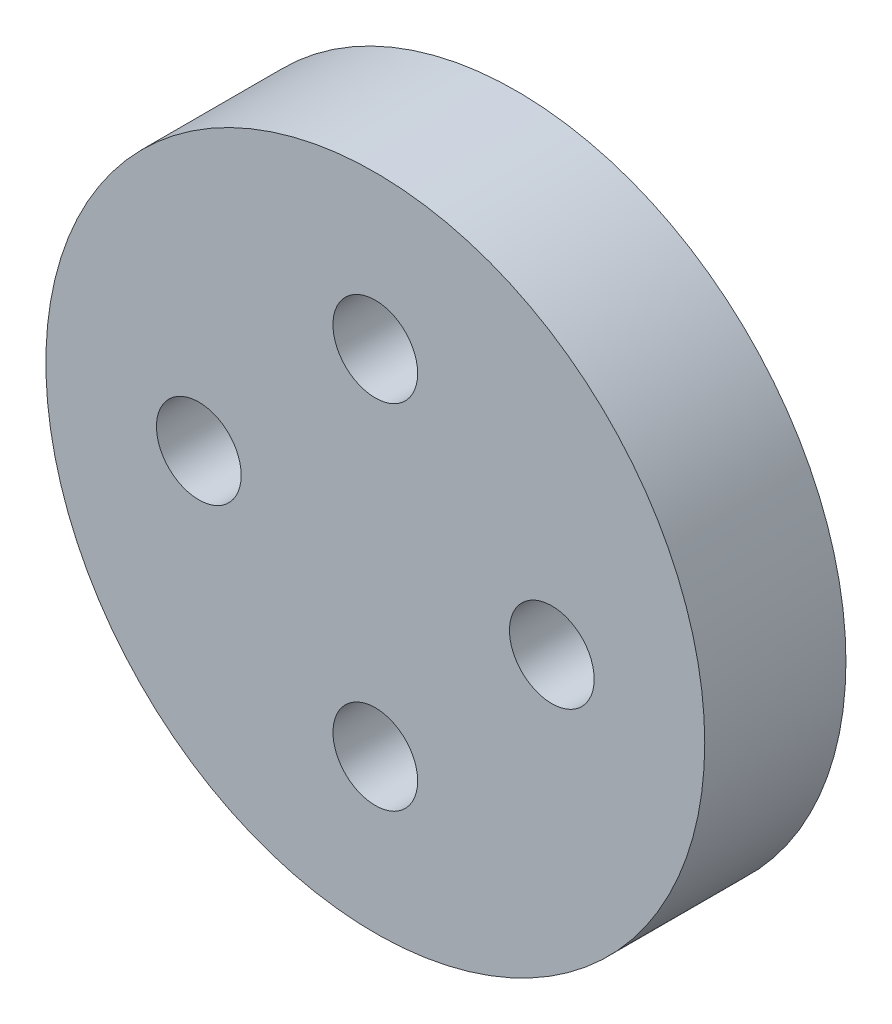
ISO-10303-21;
HEADER;
FILE_DESCRIPTION(('STEP AP214'),'2;1');
FILE_NAME('part.step','',(''),(''),'','','');
FILE_SCHEMA(('AUTOMOTIVE_DESIGN { 1 0 10303 214 1 1 1 1 }'));
ENDSEC;
DATA;
#1=APPLICATION_CONTEXT('core data for automotive mechanical design processes');
#2=APPLICATION_PROTOCOL_DEFINITION('international standard','automotive_design',2000,#1);
#3=PRODUCT_CONTEXT('',#1,'mechanical');
#4=PRODUCT('Part','Part','',(#3));
#5=PRODUCT_RELATED_PRODUCT_CATEGORY('part','',(#4));
#6=PRODUCT_DEFINITION_FORMATION('','',#4);
#7=PRODUCT_DEFINITION_CONTEXT('part definition',#1,'design');
#8=PRODUCT_DEFINITION('design','',#6,#7);
#9=PRODUCT_DEFINITION_SHAPE('','',#8);
#10=(LENGTH_UNIT() NAMED_UNIT(*) SI_UNIT(.MILLI.,.METRE.));
#11=(NAMED_UNIT(*) PLANE_ANGLE_UNIT() SI_UNIT($,.RADIAN.));
#12=(NAMED_UNIT(*) SI_UNIT($,.STERADIAN.) SOLID_ANGLE_UNIT());
#13=UNCERTAINTY_MEASURE_WITH_UNIT(LENGTH_MEASURE(1.E-05),#10,'distance_accuracy_value','');
#14=(GEOMETRIC_REPRESENTATION_CONTEXT(3) GLOBAL_UNCERTAINTY_ASSIGNED_CONTEXT((#13)) GLOBAL_UNIT_ASSIGNED_CONTEXT((#10,
#11,#12)) REPRESENTATION_CONTEXT('',''));
#15=CARTESIAN_POINT('',(0.,0.,0.));
#16=DIRECTION('',(0.,0.,1.));
#17=DIRECTION('',(1.,0.,0.));
#18=AXIS2_PLACEMENT_3D('',#15,#16,#17);
#19=CARTESIAN_POINT('',(0.,3.75,3.));
#20=DIRECTION('',(0.,0.,-1.));
#21=DIRECTION('',(-1.,0.,0.));
#22=AXIS2_PLACEMENT_3D('',#19,#20,#21);
#23=CYLINDRICAL_SURFACE('',#22,0.9);
#24=CARTESIAN_POINT('',(0.,3.75,3.));
#25=DIRECTION('',(0.,0.,1.));
#26=DIRECTION('',(1.,0.,0.));
#27=AXIS2_PLACEMENT_3D('',#24,#25,#26);
#28=CIRCLE('',#27,0.9);
#29=CARTESIAN_POINT('',(0.899999999999999,3.75,3.));
#30=VERTEX_POINT('',#29);
#31=EDGE_CURVE('E41',#30,#30,#28,.T.);
#32=ORIENTED_EDGE('',*,*,#31,.T.);
#33=EDGE_LOOP('',(#32));
#34=FACE_BOUND('',#33,.T.);
#35=CARTESIAN_POINT('',(0.,3.75,0.));
#36=DIRECTION('',(0.,0.,1.));
#37=DIRECTION('',(1.,0.,0.));
#38=AXIS2_PLACEMENT_3D('',#35,#36,#37);
#39=CIRCLE('',#38,0.9);
#40=CARTESIAN_POINT('',(0.899999999999999,3.75,0.));
#41=VERTEX_POINT('',#40);
#42=EDGE_CURVE('E58',#41,#41,#39,.T.);
#43=ORIENTED_EDGE('',*,*,#42,.F.);
#44=EDGE_LOOP('',(#43));
#45=FACE_BOUND('',#44,.T.);
#46=ADVANCED_FACE('F33',(#34,#45),#23,.F.);
#47=CARTESIAN_POINT('',(3.75,0.,3.));
#48=DIRECTION('',(0.,0.,-1.));
#49=DIRECTION('',(-1.,0.,0.));
#50=AXIS2_PLACEMENT_3D('',#47,#48,#49);
#51=CYLINDRICAL_SURFACE('',#50,0.899999999999999);
#52=CARTESIAN_POINT('',(3.75,0.,3.));
#53=DIRECTION('',(0.,0.,1.));
#54=DIRECTION('',(1.,0.,0.));
#55=AXIS2_PLACEMENT_3D('',#52,#53,#54);
#56=CIRCLE('',#55,0.899999999999999);
#57=CARTESIAN_POINT('',(4.65,0.,3.));
#58=VERTEX_POINT('',#57);
#59=EDGE_CURVE('E46',#58,#58,#56,.T.);
#60=ORIENTED_EDGE('',*,*,#59,.T.);
#61=EDGE_LOOP('',(#60));
#62=FACE_BOUND('',#61,.T.);
#63=CARTESIAN_POINT('',(3.75,0.,0.));
#64=DIRECTION('',(0.,0.,1.));
#65=DIRECTION('',(1.,0.,0.));
#66=AXIS2_PLACEMENT_3D('',#63,#64,#65);
#67=CIRCLE('',#66,0.899999999999999);
#68=CARTESIAN_POINT('',(4.65,0.,0.));
#69=VERTEX_POINT('',#68);
#70=EDGE_CURVE('E56',#69,#69,#67,.T.);
#71=ORIENTED_EDGE('',*,*,#70,.F.);
#72=EDGE_LOOP('',(#71));
#73=FACE_BOUND('',#72,.T.);
#74=ADVANCED_FACE('F76',(#62,#73),#51,.F.);
#75=CARTESIAN_POINT('',(0.,0.,3.));
#76=DIRECTION('',(0.,0.,-1.));
#77=DIRECTION('',(-1.,0.,0.));
#78=AXIS2_PLACEMENT_3D('',#75,#76,#77);
#79=CYLINDRICAL_SURFACE('',#78,7.);
#80=CARTESIAN_POINT('',(0.,0.,3.));
#81=DIRECTION('',(0.,0.,1.));
#82=DIRECTION('',(1.,0.,0.));
#83=AXIS2_PLACEMENT_3D('',#80,#81,#82);
#84=CIRCLE('',#83,7.);
#85=CARTESIAN_POINT('',(7.,0.,3.));
#86=VERTEX_POINT('',#85);
#87=EDGE_CURVE('E67',#86,#86,#84,.T.);
#88=ORIENTED_EDGE('',*,*,#87,.F.);
#89=EDGE_LOOP('',(#88));
#90=FACE_BOUND('',#89,.T.);
#91=CARTESIAN_POINT('',(0.,0.,0.));
#92=DIRECTION('',(0.,0.,1.));
#93=DIRECTION('',(1.,0.,0.));
#94=AXIS2_PLACEMENT_3D('',#91,#92,#93);
#95=CIRCLE('',#94,7.);
#96=CARTESIAN_POINT('',(7.,0.,0.));
#97=VERTEX_POINT('',#96);
#98=EDGE_CURVE('E53',#97,#97,#95,.T.);
#99=ORIENTED_EDGE('',*,*,#98,.T.);
#100=EDGE_LOOP('',(#99));
#101=FACE_BOUND('',#100,.T.);
#102=ADVANCED_FACE('F95',(#90,#101),#79,.T.);
#103=CARTESIAN_POINT('',(0.,-3.75,3.));
#104=DIRECTION('',(0.,0.,-1.));
#105=DIRECTION('',(-1.,0.,0.));
#106=AXIS2_PLACEMENT_3D('',#103,#104,#105);
#107=CYLINDRICAL_SURFACE('',#106,0.9);
#108=CARTESIAN_POINT('',(0.,-3.75,3.));
#109=DIRECTION('',(0.,0.,1.));
#110=DIRECTION('',(1.,0.,0.));
#111=AXIS2_PLACEMENT_3D('',#108,#109,#110);
#112=CIRCLE('',#111,0.9);
#113=CARTESIAN_POINT('',(0.9,-3.75,3.));
#114=VERTEX_POINT('',#113);
#115=EDGE_CURVE('E63',#114,#114,#112,.T.);
#116=ORIENTED_EDGE('',*,*,#115,.T.);
#117=EDGE_LOOP('',(#116));
#118=FACE_BOUND('',#117,.T.);
#119=CARTESIAN_POINT('',(0.,-3.75,0.));
#120=DIRECTION('',(0.,0.,1.));
#121=DIRECTION('',(1.,0.,0.));
#122=AXIS2_PLACEMENT_3D('',#119,#120,#121);
#123=CIRCLE('',#122,0.9);
#124=CARTESIAN_POINT('',(0.9,-3.75,0.));
#125=VERTEX_POINT('',#124);
#126=EDGE_CURVE('E50',#125,#125,#123,.T.);
#127=ORIENTED_EDGE('',*,*,#126,.F.);
#128=EDGE_LOOP('',(#127));
#129=FACE_BOUND('',#128,.T.);
#130=ADVANCED_FACE('F35',(#118,#129),#107,.F.);
#131=CARTESIAN_POINT('',(-3.75,0.,3.));
#132=DIRECTION('',(0.,0.,-1.));
#133=DIRECTION('',(-1.,0.,0.));
#134=AXIS2_PLACEMENT_3D('',#131,#132,#133);
#135=CYLINDRICAL_SURFACE('',#134,0.9);
#136=CARTESIAN_POINT('',(-3.75,0.,3.));
#137=DIRECTION('',(0.,0.,1.));
#138=DIRECTION('',(1.,0.,0.));
#139=AXIS2_PLACEMENT_3D('',#136,#137,#138);
#140=CIRCLE('',#139,0.9);
#141=CARTESIAN_POINT('',(-2.85,0.,3.));
#142=VERTEX_POINT('',#141);
#143=EDGE_CURVE('E10',#142,#142,#140,.T.);
#144=ORIENTED_EDGE('',*,*,#143,.T.);
#145=EDGE_LOOP('',(#144));
#146=FACE_BOUND('',#145,.T.);
#147=CARTESIAN_POINT('',(-3.75,0.,0.));
#148=DIRECTION('',(0.,0.,1.));
#149=DIRECTION('',(1.,0.,0.));
#150=AXIS2_PLACEMENT_3D('',#147,#148,#149);
#151=CIRCLE('',#150,0.9);
#152=CARTESIAN_POINT('',(-2.85,0.,0.));
#153=VERTEX_POINT('',#152);
#154=EDGE_CURVE('E37',#153,#153,#151,.T.);
#155=ORIENTED_EDGE('',*,*,#154,.F.);
#156=EDGE_LOOP('',(#155));
#157=FACE_BOUND('',#156,.T.);
#158=ADVANCED_FACE('F83',(#146,#157),#135,.F.);
#159=CARTESIAN_POINT('',(0.,0.,3.));
#160=DIRECTION('',(0.,0.,1.));
#161=DIRECTION('',(1.,0.,0.));
#162=AXIS2_PLACEMENT_3D('',#159,#160,#161);
#163=PLANE('',#162);
#164=ORIENTED_EDGE('',*,*,#115,.F.);
#165=EDGE_LOOP('',(#164));
#166=FACE_BOUND('',#165,.T.);
#167=ORIENTED_EDGE('',*,*,#87,.T.);
#168=EDGE_LOOP('',(#167));
#169=FACE_BOUND('',#168,.T.);
#170=ORIENTED_EDGE('',*,*,#59,.F.);
#171=EDGE_LOOP('',(#170));
#172=FACE_BOUND('',#171,.T.);
#173=ORIENTED_EDGE('',*,*,#31,.F.);
#174=EDGE_LOOP('',(#173));
#175=FACE_BOUND('',#174,.T.);
#176=ORIENTED_EDGE('',*,*,#143,.F.);
#177=EDGE_LOOP('',(#176));
#178=FACE_BOUND('',#177,.T.);
#179=ADVANCED_FACE('F79',(#166,#169,#172,#175,#178),#163,.T.);
#180=CARTESIAN_POINT('',(0.,0.,0.));
#181=DIRECTION('',(0.,0.,1.));
#182=DIRECTION('',(1.,0.,0.));
#183=AXIS2_PLACEMENT_3D('',#180,#181,#182);
#184=PLANE('',#183);
#185=ORIENTED_EDGE('',*,*,#126,.T.);
#186=EDGE_LOOP('',(#185));
#187=FACE_BOUND('',#186,.T.);
#188=ORIENTED_EDGE('',*,*,#98,.F.);
#189=EDGE_LOOP('',(#188));
#190=FACE_BOUND('',#189,.T.);
#191=ORIENTED_EDGE('',*,*,#70,.T.);
#192=EDGE_LOOP('',(#191));
#193=FACE_BOUND('',#192,.T.);
#194=ORIENTED_EDGE('',*,*,#42,.T.);
#195=EDGE_LOOP('',(#194));
#196=FACE_BOUND('',#195,.T.);
#197=ORIENTED_EDGE('',*,*,#154,.T.);
#198=EDGE_LOOP('',(#197));
#199=FACE_BOUND('',#198,.T.);
#200=ADVANCED_FACE('F82',(#187,#190,#193,#196,#199),#184,.F.);
#201=CLOSED_SHELL('',(#46,#74,#102,#130,#158,#179,#200));
#202=MANIFOLD_SOLID_BREP('B2',#201);
#203=ADVANCED_BREP_SHAPE_REPRESENTATION('',(#18,#202),#14);
#204=SHAPE_DEFINITION_REPRESENTATION(#9,#203);
ENDSEC;
END-ISO-10303-21;
